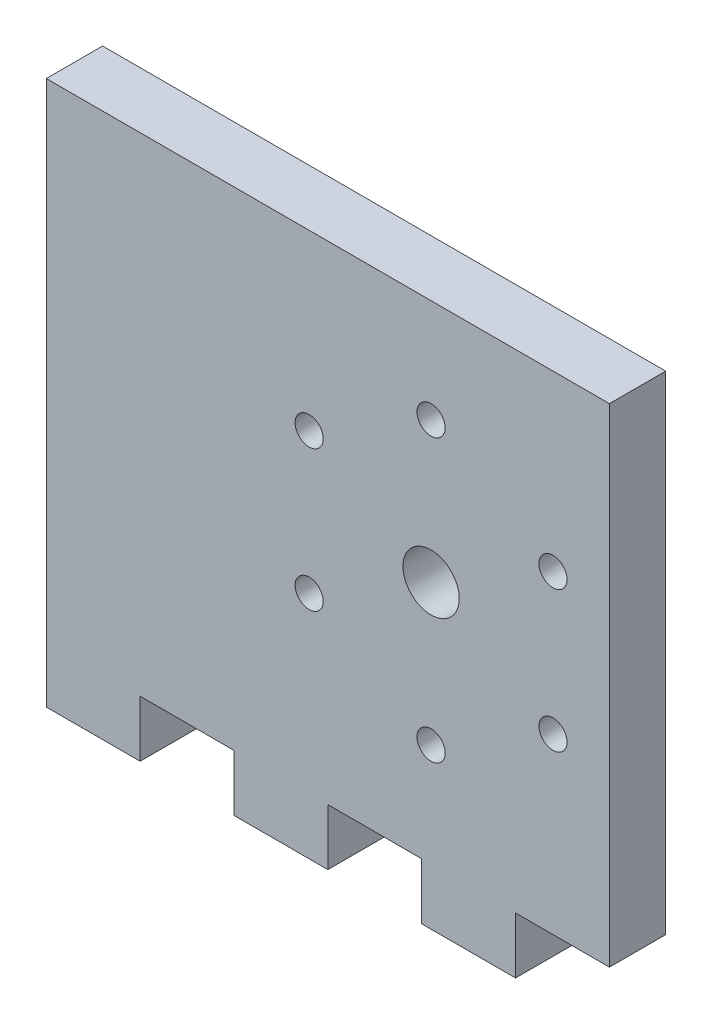
ISO-10303-21;
HEADER;
FILE_DESCRIPTION(('STEP AP214'),'2;1');
FILE_NAME('part.step','',(''),(''),'','','');
FILE_SCHEMA(('AUTOMOTIVE_DESIGN { 1 0 10303 214 1 1 1 1 }'));
ENDSEC;
DATA;
#1=APPLICATION_CONTEXT('core data for automotive mechanical design processes');
#2=APPLICATION_PROTOCOL_DEFINITION('international standard','automotive_design',2000,#1);
#3=PRODUCT_CONTEXT('',#1,'mechanical');
#4=PRODUCT('Part','Part','',(#3));
#5=PRODUCT_RELATED_PRODUCT_CATEGORY('part','',(#4));
#6=PRODUCT_DEFINITION_FORMATION('','',#4);
#7=PRODUCT_DEFINITION_CONTEXT('part definition',#1,'design');
#8=PRODUCT_DEFINITION('design','',#6,#7);
#9=PRODUCT_DEFINITION_SHAPE('','',#8);
#10=(LENGTH_UNIT() NAMED_UNIT(*) SI_UNIT(.MILLI.,.METRE.));
#11=(NAMED_UNIT(*) PLANE_ANGLE_UNIT() SI_UNIT($,.RADIAN.));
#12=(NAMED_UNIT(*) SI_UNIT($,.STERADIAN.) SOLID_ANGLE_UNIT());
#13=UNCERTAINTY_MEASURE_WITH_UNIT(LENGTH_MEASURE(1.E-05),#10,'distance_accuracy_value','');
#14=(GEOMETRIC_REPRESENTATION_CONTEXT(3) GLOBAL_UNCERTAINTY_ASSIGNED_CONTEXT((#13)) GLOBAL_UNIT_ASSIGNED_CONTEXT((#10,
#11,#12)) REPRESENTATION_CONTEXT('',''));
#15=CARTESIAN_POINT('',(0.,0.,0.));
#16=DIRECTION('',(0.,0.,1.));
#17=DIRECTION('',(1.,0.,0.));
#18=AXIS2_PLACEMENT_3D('',#15,#16,#17);
#19=CARTESIAN_POINT('',(0.,0.,3.));
#20=DIRECTION('',(0.,0.,-1.));
#21=DIRECTION('',(-1.,0.,0.));
#22=AXIS2_PLACEMENT_3D('',#19,#20,#21);
#23=PLANE('',#22);
#24=DIRECTION('',(-1.,0.,0.));
#25=VECTOR('',#24,1.);
#26=CARTESIAN_POINT('',(25.,0.,3.));
#27=LINE('',#26,#25);
#28=CARTESIAN_POINT('',(30.,0.,3.));
#29=VERTEX_POINT('',#28);
#30=CARTESIAN_POINT('',(0.,0.,3.));
#31=VERTEX_POINT('',#30);
#32=EDGE_CURVE('E226',#29,#31,#27,.T.);
#33=ORIENTED_EDGE('',*,*,#32,.T.);
#34=DIRECTION('',(0.,-1.,0.));
#35=VECTOR('',#34,1.);
#36=CARTESIAN_POINT('',(0.,0.,3.));
#37=LINE('',#36,#35);
#38=CARTESIAN_POINT('',(0.,-29.,3.));
#39=VERTEX_POINT('',#38);
#40=EDGE_CURVE('E247',#31,#39,#37,.T.);
#41=ORIENTED_EDGE('',*,*,#40,.T.);
#42=DIRECTION('',(1.,0.,0.));
#43=VECTOR('',#42,1.);
#44=CARTESIAN_POINT('',(0.,-29.,3.));
#45=LINE('',#44,#43);
#46=CARTESIAN_POINT('',(4.99999999999994,-29.,3.));
#47=VERTEX_POINT('',#46);
#48=EDGE_CURVE('E244',#39,#47,#45,.T.);
#49=ORIENTED_EDGE('',*,*,#48,.T.);
#50=DIRECTION('',(0.,1.,0.));
#51=VECTOR('',#50,1.);
#52=CARTESIAN_POINT('',(4.99999999999994,-29.,3.));
#53=LINE('',#52,#51);
#54=CARTESIAN_POINT('',(4.99999999999994,-26.,3.));
#55=VERTEX_POINT('',#54);
#56=EDGE_CURVE('E246',#47,#55,#53,.T.);
#57=ORIENTED_EDGE('',*,*,#56,.T.);
#58=DIRECTION('',(1.,0.,0.));
#59=VECTOR('',#58,1.);
#60=CARTESIAN_POINT('',(4.99999999999994,-26.,3.));
#61=LINE('',#60,#59);
#62=CARTESIAN_POINT('',(9.99999999999994,-26.,3.));
#63=VERTEX_POINT('',#62);
#64=EDGE_CURVE('E249',#55,#63,#61,.T.);
#65=ORIENTED_EDGE('',*,*,#64,.T.);
#66=DIRECTION('',(0.,-1.,0.));
#67=VECTOR('',#66,1.);
#68=CARTESIAN_POINT('',(9.99999999999994,-26.,3.));
#69=LINE('',#68,#67);
#70=CARTESIAN_POINT('',(9.99999999999995,-29.,3.));
#71=VERTEX_POINT('',#70);
#72=EDGE_CURVE('E255',#63,#71,#69,.T.);
#73=ORIENTED_EDGE('',*,*,#72,.T.);
#74=DIRECTION('',(1.,0.,0.));
#75=VECTOR('',#74,1.);
#76=CARTESIAN_POINT('',(9.99999999999995,-29.,3.));
#77=LINE('',#76,#75);
#78=CARTESIAN_POINT('',(14.9999999999999,-29.,3.));
#79=VERTEX_POINT('',#78);
#80=EDGE_CURVE('E257',#71,#79,#77,.T.);
#81=ORIENTED_EDGE('',*,*,#80,.T.);
#82=DIRECTION('',(0.,1.,0.));
#83=VECTOR('',#82,1.);
#84=CARTESIAN_POINT('',(14.9999999999999,-29.,3.));
#85=LINE('',#84,#83);
#86=CARTESIAN_POINT('',(15.,-26.,3.));
#87=VERTEX_POINT('',#86);
#88=EDGE_CURVE('E259',#79,#87,#85,.T.);
#89=ORIENTED_EDGE('',*,*,#88,.T.);
#90=DIRECTION('',(1.,0.,0.));
#91=VECTOR('',#90,1.);
#92=CARTESIAN_POINT('',(15.,-26.,3.));
#93=LINE('',#92,#91);
#94=CARTESIAN_POINT('',(20.,-26.,3.));
#95=VERTEX_POINT('',#94);
#96=EDGE_CURVE('E148',#87,#95,#93,.T.);
#97=ORIENTED_EDGE('',*,*,#96,.T.);
#98=DIRECTION('',(0.,-1.,0.));
#99=VECTOR('',#98,1.);
#100=CARTESIAN_POINT('',(20.,-29.,3.));
#101=LINE('',#100,#99);
#102=CARTESIAN_POINT('',(20.,-29.,3.));
#103=VERTEX_POINT('',#102);
#104=EDGE_CURVE('E142',#95,#103,#101,.T.);
#105=ORIENTED_EDGE('',*,*,#104,.T.);
#106=DIRECTION('',(1.,0.,0.));
#107=VECTOR('',#106,1.);
#108=CARTESIAN_POINT('',(20.,-29.,3.));
#109=LINE('',#108,#107);
#110=CARTESIAN_POINT('',(25.,-29.,3.));
#111=VERTEX_POINT('',#110);
#112=EDGE_CURVE('E146',#103,#111,#109,.T.);
#113=ORIENTED_EDGE('',*,*,#112,.T.);
#114=DIRECTION('',(0.,1.,0.));
#115=VECTOR('',#114,1.);
#116=CARTESIAN_POINT('',(25.,-29.,3.));
#117=LINE('',#116,#115);
#118=CARTESIAN_POINT('',(25.,-26.,3.));
#119=VERTEX_POINT('',#118);
#120=EDGE_CURVE('E50',#111,#119,#117,.T.);
#121=ORIENTED_EDGE('',*,*,#120,.T.);
#122=DIRECTION('',(1.,0.,0.));
#123=VECTOR('',#122,1.);
#124=CARTESIAN_POINT('',(25.,-26.,3.));
#125=LINE('',#124,#123);
#126=CARTESIAN_POINT('',(30.,-26.,3.));
#127=VERTEX_POINT('',#126);
#128=EDGE_CURVE('E194',#119,#127,#125,.T.);
#129=ORIENTED_EDGE('',*,*,#128,.T.);
#130=DIRECTION('',(0.,1.,0.));
#131=VECTOR('',#130,1.);
#132=CARTESIAN_POINT('',(30.,0.,3.));
#133=LINE('',#132,#131);
#134=EDGE_CURVE('E111',#127,#29,#133,.T.);
#135=ORIENTED_EDGE('',*,*,#134,.T.);
#136=EDGE_LOOP('',(#33,#41,#49,#57,#65,#73,#81,#89,#97,#105,#113,#121,#129,#135));
#137=FACE_BOUND('',#136,.T.);
#138=CARTESIAN_POINT('',(20.5,-5.50000000000007,3.));
#139=DIRECTION('',(0.,0.,1.));
#140=DIRECTION('',(1.,0.,0.));
#141=AXIS2_PLACEMENT_3D('',#138,#139,#140);
#142=CIRCLE('',#141,0.750000000000002);
#143=CARTESIAN_POINT('',(21.25,-5.50000000000007,3.));
#144=VERTEX_POINT('',#143);
#145=EDGE_CURVE('E170',#144,#144,#142,.T.);
#146=ORIENTED_EDGE('',*,*,#145,.F.);
#147=EDGE_LOOP('',(#146));
#148=FACE_BOUND('',#147,.T.);
#149=CARTESIAN_POINT('',(20.5,-13.0000000000001,3.));
#150=DIRECTION('',(0.,0.,1.));
#151=DIRECTION('',(1.,0.,0.));
#152=AXIS2_PLACEMENT_3D('',#149,#150,#151);
#153=CIRCLE('',#152,1.5);
#154=CARTESIAN_POINT('',(22.,-13.0000000000001,3.));
#155=VERTEX_POINT('',#154);
#156=EDGE_CURVE('E501',#155,#155,#153,.T.);
#157=ORIENTED_EDGE('',*,*,#156,.F.);
#158=EDGE_LOOP('',(#157));
#159=FACE_BOUND('',#158,.T.);
#160=CARTESIAN_POINT('',(26.9951905283833,-9.25000000000007,3.));
#161=DIRECTION('',(0.,0.,1.));
#162=DIRECTION('',(1.,0.,0.));
#163=AXIS2_PLACEMENT_3D('',#160,#161,#162);
#164=CIRCLE('',#163,0.750000000000002);
#165=CARTESIAN_POINT('',(27.7451905283833,-9.25000000000007,3.));
#166=VERTEX_POINT('',#165);
#167=EDGE_CURVE('E507',#166,#166,#164,.T.);
#168=ORIENTED_EDGE('',*,*,#167,.F.);
#169=EDGE_LOOP('',(#168));
#170=FACE_BOUND('',#169,.T.);
#171=CARTESIAN_POINT('',(26.9951905283833,-16.7500000000001,3.));
#172=DIRECTION('',(0.,0.,1.));
#173=DIRECTION('',(1.,0.,0.));
#174=AXIS2_PLACEMENT_3D('',#171,#172,#173);
#175=CIRCLE('',#174,0.750000000000005);
#176=CARTESIAN_POINT('',(27.7451905283833,-16.7500000000001,3.));
#177=VERTEX_POINT('',#176);
#178=EDGE_CURVE('E513',#177,#177,#175,.T.);
#179=ORIENTED_EDGE('',*,*,#178,.F.);
#180=EDGE_LOOP('',(#179));
#181=FACE_BOUND('',#180,.T.);
#182=CARTESIAN_POINT('',(20.5,-20.5000000000001,3.));
#183=DIRECTION('',(0.,0.,1.));
#184=DIRECTION('',(1.,0.,0.));
#185=AXIS2_PLACEMENT_3D('',#182,#183,#184);
#186=CIRCLE('',#185,0.750000000000002);
#187=CARTESIAN_POINT('',(21.25,-20.5000000000001,3.));
#188=VERTEX_POINT('',#187);
#189=EDGE_CURVE('E519',#188,#188,#186,.T.);
#190=ORIENTED_EDGE('',*,*,#189,.F.);
#191=EDGE_LOOP('',(#190));
#192=FACE_BOUND('',#191,.T.);
#193=CARTESIAN_POINT('',(14.0048094716167,-16.7500000000001,3.));
#194=DIRECTION('',(0.,0.,1.));
#195=DIRECTION('',(1.,0.,0.));
#196=AXIS2_PLACEMENT_3D('',#193,#194,#195);
#197=CIRCLE('',#196,0.750000000000002);
#198=CARTESIAN_POINT('',(14.7548094716167,-16.7500000000001,3.));
#199=VERTEX_POINT('',#198);
#200=EDGE_CURVE('E525',#199,#199,#197,.T.);
#201=ORIENTED_EDGE('',*,*,#200,.F.);
#202=EDGE_LOOP('',(#201));
#203=FACE_BOUND('',#202,.T.);
#204=CARTESIAN_POINT('',(14.0048094716167,-9.25000000000008,3.));
#205=DIRECTION('',(0.,0.,1.));
#206=DIRECTION('',(1.,0.,0.));
#207=AXIS2_PLACEMENT_3D('',#204,#205,#206);
#208=CIRCLE('',#207,0.750000000000002);
#209=CARTESIAN_POINT('',(14.7548094716167,-9.25000000000008,3.));
#210=VERTEX_POINT('',#209);
#211=EDGE_CURVE('E531',#210,#210,#208,.T.);
#212=ORIENTED_EDGE('',*,*,#211,.F.);
#213=EDGE_LOOP('',(#212));
#214=FACE_BOUND('',#213,.T.);
#215=ADVANCED_FACE('F33',(#137,#148,#159,#170,#181,#192,#203,#214),#23,.F.);
#216=CARTESIAN_POINT('',(0.,0.,0.));
#217=DIRECTION('',(0.,0.,-1.));
#218=DIRECTION('',(-1.,0.,0.));
#219=AXIS2_PLACEMENT_3D('',#216,#217,#218);
#220=PLANE('',#219);
#221=DIRECTION('',(-1.,0.,0.));
#222=VECTOR('',#221,1.);
#223=CARTESIAN_POINT('',(0.,0.,0.));
#224=LINE('',#223,#222);
#225=CARTESIAN_POINT('',(30.,0.,0.));
#226=VERTEX_POINT('',#225);
#227=CARTESIAN_POINT('',(0.,0.,0.));
#228=VERTEX_POINT('',#227);
#229=EDGE_CURVE('E173',#226,#228,#224,.T.);
#230=ORIENTED_EDGE('',*,*,#229,.F.);
#231=DIRECTION('',(0.,1.,0.));
#232=VECTOR('',#231,1.);
#233=CARTESIAN_POINT('',(30.,0.,0.));
#234=LINE('',#233,#232);
#235=CARTESIAN_POINT('',(30.,-26.,0.));
#236=VERTEX_POINT('',#235);
#237=EDGE_CURVE('E169',#236,#226,#234,.T.);
#238=ORIENTED_EDGE('',*,*,#237,.F.);
#239=DIRECTION('',(1.,0.,0.));
#240=VECTOR('',#239,1.);
#241=CARTESIAN_POINT('',(25.,-26.,0.));
#242=LINE('',#241,#240);
#243=CARTESIAN_POINT('',(25.,-26.,0.));
#244=VERTEX_POINT('',#243);
#245=EDGE_CURVE('E166',#244,#236,#242,.T.);
#246=ORIENTED_EDGE('',*,*,#245,.F.);
#247=DIRECTION('',(0.,1.,0.));
#248=VECTOR('',#247,1.);
#249=CARTESIAN_POINT('',(25.,-29.,0.));
#250=LINE('',#249,#248);
#251=CARTESIAN_POINT('',(25.,-29.,0.));
#252=VERTEX_POINT('',#251);
#253=EDGE_CURVE('E103',#252,#244,#250,.T.);
#254=ORIENTED_EDGE('',*,*,#253,.F.);
#255=DIRECTION('',(1.,0.,0.));
#256=VECTOR('',#255,1.);
#257=CARTESIAN_POINT('',(20.,-29.,0.));
#258=LINE('',#257,#256);
#259=CARTESIAN_POINT('',(20.,-29.,0.));
#260=VERTEX_POINT('',#259);
#261=EDGE_CURVE('E97',#260,#252,#258,.T.);
#262=ORIENTED_EDGE('',*,*,#261,.F.);
#263=DIRECTION('',(0.,-1.,0.));
#264=VECTOR('',#263,1.);
#265=CARTESIAN_POINT('',(20.,-29.,0.));
#266=LINE('',#265,#264);
#267=CARTESIAN_POINT('',(20.,-26.,0.));
#268=VERTEX_POINT('',#267);
#269=EDGE_CURVE('E156',#268,#260,#266,.T.);
#270=ORIENTED_EDGE('',*,*,#269,.F.);
#271=DIRECTION('',(1.,0.,0.));
#272=VECTOR('',#271,1.);
#273=CARTESIAN_POINT('',(15.,-26.,0.));
#274=LINE('',#273,#272);
#275=CARTESIAN_POINT('',(15.,-26.,0.));
#276=VERTEX_POINT('',#275);
#277=EDGE_CURVE('E189',#276,#268,#274,.T.);
#278=ORIENTED_EDGE('',*,*,#277,.F.);
#279=DIRECTION('',(0.,1.,0.));
#280=VECTOR('',#279,1.);
#281=CARTESIAN_POINT('',(14.9999999999999,-29.,0.));
#282=LINE('',#281,#280);
#283=CARTESIAN_POINT('',(14.9999999999999,-29.,0.));
#284=VERTEX_POINT('',#283);
#285=EDGE_CURVE('E187',#284,#276,#282,.T.);
#286=ORIENTED_EDGE('',*,*,#285,.F.);
#287=DIRECTION('',(1.,0.,0.));
#288=VECTOR('',#287,1.);
#289=CARTESIAN_POINT('',(9.99999999999995,-29.,0.));
#290=LINE('',#289,#288);
#291=CARTESIAN_POINT('',(9.99999999999995,-29.,0.));
#292=VERTEX_POINT('',#291);
#293=EDGE_CURVE('E185',#292,#284,#290,.T.);
#294=ORIENTED_EDGE('',*,*,#293,.F.);
#295=DIRECTION('',(0.,-1.,0.));
#296=VECTOR('',#295,1.);
#297=CARTESIAN_POINT('',(9.99999999999994,-26.,0.));
#298=LINE('',#297,#296);
#299=CARTESIAN_POINT('',(9.99999999999994,-26.,0.));
#300=VERTEX_POINT('',#299);
#301=EDGE_CURVE('E183',#300,#292,#298,.T.);
#302=ORIENTED_EDGE('',*,*,#301,.F.);
#303=DIRECTION('',(1.,0.,0.));
#304=VECTOR('',#303,1.);
#305=CARTESIAN_POINT('',(4.99999999999994,-26.,0.));
#306=LINE('',#305,#304);
#307=CARTESIAN_POINT('',(4.99999999999994,-26.,0.));
#308=VERTEX_POINT('',#307);
#309=EDGE_CURVE('E181',#308,#300,#306,.T.);
#310=ORIENTED_EDGE('',*,*,#309,.F.);
#311=DIRECTION('',(0.,1.,0.));
#312=VECTOR('',#311,1.);
#313=CARTESIAN_POINT('',(4.99999999999994,-29.,0.));
#314=LINE('',#313,#312);
#315=CARTESIAN_POINT('',(4.99999999999994,-29.,0.));
#316=VERTEX_POINT('',#315);
#317=EDGE_CURVE('E179',#316,#308,#314,.T.);
#318=ORIENTED_EDGE('',*,*,#317,.F.);
#319=DIRECTION('',(1.,0.,0.));
#320=VECTOR('',#319,1.);
#321=CARTESIAN_POINT('',(0.,-29.,0.));
#322=LINE('',#321,#320);
#323=CARTESIAN_POINT('',(0.,-29.,0.));
#324=VERTEX_POINT('',#323);
#325=EDGE_CURVE('E177',#324,#316,#322,.T.);
#326=ORIENTED_EDGE('',*,*,#325,.F.);
#327=DIRECTION('',(0.,-1.,0.));
#328=VECTOR('',#327,1.);
#329=CARTESIAN_POINT('',(0.,0.,0.));
#330=LINE('',#329,#328);
#331=EDGE_CURVE('E175',#228,#324,#330,.T.);
#332=ORIENTED_EDGE('',*,*,#331,.F.);
#333=EDGE_LOOP('',(#230,#238,#246,#254,#262,#270,#278,#286,#294,#302,#310,#318,#326,#332));
#334=FACE_BOUND('',#333,.T.);
#335=CARTESIAN_POINT('',(14.0048094716167,-16.7500000000001,0.));
#336=DIRECTION('',(0.,0.,1.));
#337=DIRECTION('',(1.,0.,0.));
#338=AXIS2_PLACEMENT_3D('',#335,#336,#337);
#339=CIRCLE('',#338,0.750000000000002);
#340=CARTESIAN_POINT('',(14.7548094716167,-16.7500000000001,0.));
#341=VERTEX_POINT('',#340);
#342=EDGE_CURVE('E528',#341,#341,#339,.T.);
#343=ORIENTED_EDGE('',*,*,#342,.T.);
#344=EDGE_LOOP('',(#343));
#345=FACE_BOUND('',#344,.T.);
#346=CARTESIAN_POINT('',(26.9951905283833,-16.7500000000001,0.));
#347=DIRECTION('',(0.,0.,1.));
#348=DIRECTION('',(1.,0.,0.));
#349=AXIS2_PLACEMENT_3D('',#346,#347,#348);
#350=CIRCLE('',#349,0.750000000000005);
#351=CARTESIAN_POINT('',(27.7451905283833,-16.7500000000001,0.));
#352=VERTEX_POINT('',#351);
#353=EDGE_CURVE('E516',#352,#352,#350,.T.);
#354=ORIENTED_EDGE('',*,*,#353,.T.);
#355=EDGE_LOOP('',(#354));
#356=FACE_BOUND('',#355,.T.);
#357=CARTESIAN_POINT('',(20.5,-13.0000000000001,0.));
#358=DIRECTION('',(0.,0.,1.));
#359=DIRECTION('',(1.,0.,0.));
#360=AXIS2_PLACEMENT_3D('',#357,#358,#359);
#361=CIRCLE('',#360,1.5);
#362=CARTESIAN_POINT('',(22.,-13.0000000000001,0.));
#363=VERTEX_POINT('',#362);
#364=EDGE_CURVE('E504',#363,#363,#361,.T.);
#365=ORIENTED_EDGE('',*,*,#364,.T.);
#366=EDGE_LOOP('',(#365));
#367=FACE_BOUND('',#366,.T.);
#368=CARTESIAN_POINT('',(20.5,-5.50000000000007,0.));
#369=DIRECTION('',(0.,0.,1.));
#370=DIRECTION('',(1.,0.,0.));
#371=AXIS2_PLACEMENT_3D('',#368,#369,#370);
#372=CIRCLE('',#371,0.750000000000002);
#373=CARTESIAN_POINT('',(21.25,-5.50000000000007,0.));
#374=VERTEX_POINT('',#373);
#375=EDGE_CURVE('E498',#374,#374,#372,.T.);
#376=ORIENTED_EDGE('',*,*,#375,.T.);
#377=EDGE_LOOP('',(#376));
#378=FACE_BOUND('',#377,.T.);
#379=CARTESIAN_POINT('',(26.9951905283833,-9.25000000000007,0.));
#380=DIRECTION('',(0.,0.,1.));
#381=DIRECTION('',(1.,0.,0.));
#382=AXIS2_PLACEMENT_3D('',#379,#380,#381);
#383=CIRCLE('',#382,0.750000000000002);
#384=CARTESIAN_POINT('',(27.7451905283833,-9.25000000000007,0.));
#385=VERTEX_POINT('',#384);
#386=EDGE_CURVE('E510',#385,#385,#383,.T.);
#387=ORIENTED_EDGE('',*,*,#386,.T.);
#388=EDGE_LOOP('',(#387));
#389=FACE_BOUND('',#388,.T.);
#390=CARTESIAN_POINT('',(20.5,-20.5000000000001,0.));
#391=DIRECTION('',(0.,0.,1.));
#392=DIRECTION('',(1.,0.,0.));
#393=AXIS2_PLACEMENT_3D('',#390,#391,#392);
#394=CIRCLE('',#393,0.750000000000002);
#395=CARTESIAN_POINT('',(21.25,-20.5000000000001,0.));
#396=VERTEX_POINT('',#395);
#397=EDGE_CURVE('E522',#396,#396,#394,.T.);
#398=ORIENTED_EDGE('',*,*,#397,.T.);
#399=EDGE_LOOP('',(#398));
#400=FACE_BOUND('',#399,.T.);
#401=CARTESIAN_POINT('',(14.0048094716167,-9.25000000000008,0.));
#402=DIRECTION('',(0.,0.,1.));
#403=DIRECTION('',(1.,0.,0.));
#404=AXIS2_PLACEMENT_3D('',#401,#402,#403);
#405=CIRCLE('',#404,0.750000000000002);
#406=CARTESIAN_POINT('',(14.7548094716167,-9.25000000000008,0.));
#407=VERTEX_POINT('',#406);
#408=EDGE_CURVE('E534',#407,#407,#405,.T.);
#409=ORIENTED_EDGE('',*,*,#408,.T.);
#410=EDGE_LOOP('',(#409));
#411=FACE_BOUND('',#410,.T.);
#412=ADVANCED_FACE('F231',(#334,#345,#356,#367,#378,#389,#400,#411),#220,.T.);
#413=CARTESIAN_POINT('',(25.,-26.,3.));
#414=DIRECTION('',(0.,1.,0.));
#415=DIRECTION('',(-1.,0.,0.));
#416=AXIS2_PLACEMENT_3D('',#413,#414,#415);
#417=PLANE('',#416);
#418=ORIENTED_EDGE('',*,*,#245,.T.);
#419=DIRECTION('',(0.,0.,-1.));
#420=VECTOR('',#419,1.);
#421=CARTESIAN_POINT('',(30.,-26.,3.));
#422=LINE('',#421,#420);
#423=EDGE_CURVE('E11',#127,#236,#422,.T.);
#424=ORIENTED_EDGE('',*,*,#423,.F.);
#425=ORIENTED_EDGE('',*,*,#128,.F.);
#426=DIRECTION('',(0.,0.,-1.));
#427=VECTOR('',#426,1.);
#428=CARTESIAN_POINT('',(25.,-26.,3.));
#429=LINE('',#428,#427);
#430=EDGE_CURVE('E162',#119,#244,#429,.T.);
#431=ORIENTED_EDGE('',*,*,#430,.T.);
#432=EDGE_LOOP('',(#418,#424,#425,#431));
#433=FACE_BOUND('',#432,.T.);
#434=ADVANCED_FACE('F35',(#433),#417,.F.);
#435=CARTESIAN_POINT('',(30.,0.,3.));
#436=DIRECTION('',(-1.,0.,0.));
#437=DIRECTION('',(0.,-1.,0.));
#438=AXIS2_PLACEMENT_3D('',#435,#436,#437);
#439=PLANE('',#438);
#440=ORIENTED_EDGE('',*,*,#237,.T.);
#441=DIRECTION('',(0.,0.,-1.));
#442=VECTOR('',#441,1.);
#443=CARTESIAN_POINT('',(30.,0.,3.));
#444=LINE('',#443,#442);
#445=EDGE_CURVE('E42',#29,#226,#444,.T.);
#446=ORIENTED_EDGE('',*,*,#445,.F.);
#447=ORIENTED_EDGE('',*,*,#134,.F.);
#448=ORIENTED_EDGE('',*,*,#423,.T.);
#449=EDGE_LOOP('',(#440,#446,#447,#448));
#450=FACE_BOUND('',#449,.T.);
#451=ADVANCED_FACE('F227',(#450),#439,.F.);
#452=CARTESIAN_POINT('',(0.,0.,3.));
#453=DIRECTION('',(0.,-1.,0.));
#454=DIRECTION('',(1.,0.,0.));
#455=AXIS2_PLACEMENT_3D('',#452,#453,#454);
#456=PLANE('',#455);
#457=ORIENTED_EDGE('',*,*,#229,.T.);
#458=DIRECTION('',(0.,0.,-1.));
#459=VECTOR('',#458,1.);
#460=CARTESIAN_POINT('',(0.,0.,3.));
#461=LINE('',#460,#459);
#462=EDGE_CURVE('E219',#31,#228,#461,.T.);
#463=ORIENTED_EDGE('',*,*,#462,.F.);
#464=ORIENTED_EDGE('',*,*,#32,.F.);
#465=ORIENTED_EDGE('',*,*,#445,.T.);
#466=EDGE_LOOP('',(#457,#463,#464,#465));
#467=FACE_BOUND('',#466,.T.);
#468=ADVANCED_FACE('F224',(#467),#456,.F.);
#469=CARTESIAN_POINT('',(0.,0.,3.));
#470=DIRECTION('',(1.,0.,0.));
#471=DIRECTION('',(0.,1.,0.));
#472=AXIS2_PLACEMENT_3D('',#469,#470,#471);
#473=PLANE('',#472);
#474=ORIENTED_EDGE('',*,*,#331,.T.);
#475=DIRECTION('',(0.,0.,-1.));
#476=VECTOR('',#475,1.);
#477=CARTESIAN_POINT('',(0.,-29.,3.));
#478=LINE('',#477,#476);
#479=EDGE_CURVE('E216',#39,#324,#478,.T.);
#480=ORIENTED_EDGE('',*,*,#479,.F.);
#481=ORIENTED_EDGE('',*,*,#40,.F.);
#482=ORIENTED_EDGE('',*,*,#462,.T.);
#483=EDGE_LOOP('',(#474,#480,#481,#482));
#484=FACE_BOUND('',#483,.T.);
#485=ADVANCED_FACE('F238',(#484),#473,.F.);
#486=CARTESIAN_POINT('',(0.,-29.,3.));
#487=DIRECTION('',(0.,1.,0.));
#488=DIRECTION('',(0.,0.,1.));
#489=AXIS2_PLACEMENT_3D('',#486,#487,#488);
#490=PLANE('',#489);
#491=ORIENTED_EDGE('',*,*,#325,.T.);
#492=DIRECTION('',(0.,0.,-1.));
#493=VECTOR('',#492,1.);
#494=CARTESIAN_POINT('',(4.99999999999994,-29.,3.));
#495=LINE('',#494,#493);
#496=EDGE_CURVE('E213',#47,#316,#495,.T.);
#497=ORIENTED_EDGE('',*,*,#496,.F.);
#498=ORIENTED_EDGE('',*,*,#48,.F.);
#499=ORIENTED_EDGE('',*,*,#479,.T.);
#500=EDGE_LOOP('',(#491,#497,#498,#499));
#501=FACE_BOUND('',#500,.T.);
#502=ADVANCED_FACE('F242',(#501),#490,.F.);
#503=CARTESIAN_POINT('',(4.99999999999994,-29.,3.));
#504=DIRECTION('',(-1.,0.,0.));
#505=DIRECTION('',(0.,0.,1.));
#506=AXIS2_PLACEMENT_3D('',#503,#504,#505);
#507=PLANE('',#506);
#508=ORIENTED_EDGE('',*,*,#317,.T.);
#509=DIRECTION('',(0.,0.,-1.));
#510=VECTOR('',#509,1.);
#511=CARTESIAN_POINT('',(4.99999999999994,-26.,3.));
#512=LINE('',#511,#510);
#513=EDGE_CURVE('E210',#55,#308,#512,.T.);
#514=ORIENTED_EDGE('',*,*,#513,.F.);
#515=ORIENTED_EDGE('',*,*,#56,.F.);
#516=ORIENTED_EDGE('',*,*,#496,.T.);
#517=EDGE_LOOP('',(#508,#514,#515,#516));
#518=FACE_BOUND('',#517,.T.);
#519=ADVANCED_FACE('F285',(#518),#507,.F.);
#520=CARTESIAN_POINT('',(4.99999999999994,-26.,3.));
#521=DIRECTION('',(0.,1.,0.));
#522=DIRECTION('',(-1.,0.,0.));
#523=AXIS2_PLACEMENT_3D('',#520,#521,#522);
#524=PLANE('',#523);
#525=ORIENTED_EDGE('',*,*,#309,.T.);
#526=DIRECTION('',(0.,0.,-1.));
#527=VECTOR('',#526,1.);
#528=CARTESIAN_POINT('',(9.99999999999994,-26.,3.));
#529=LINE('',#528,#527);
#530=EDGE_CURVE('E207',#63,#300,#529,.T.);
#531=ORIENTED_EDGE('',*,*,#530,.F.);
#532=ORIENTED_EDGE('',*,*,#64,.F.);
#533=ORIENTED_EDGE('',*,*,#513,.T.);
#534=EDGE_LOOP('',(#525,#531,#532,#533));
#535=FACE_BOUND('',#534,.T.);
#536=ADVANCED_FACE('F282',(#535),#524,.F.);
#537=CARTESIAN_POINT('',(9.99999999999994,-26.,3.));
#538=DIRECTION('',(1.,0.,0.));
#539=DIRECTION('',(0.,1.,0.));
#540=AXIS2_PLACEMENT_3D('',#537,#538,#539);
#541=PLANE('',#540);
#542=ORIENTED_EDGE('',*,*,#301,.T.);
#543=DIRECTION('',(0.,0.,-1.));
#544=VECTOR('',#543,1.);
#545=CARTESIAN_POINT('',(9.99999999999995,-29.,3.));
#546=LINE('',#545,#544);
#547=EDGE_CURVE('E204',#71,#292,#546,.T.);
#548=ORIENTED_EDGE('',*,*,#547,.F.);
#549=ORIENTED_EDGE('',*,*,#72,.F.);
#550=ORIENTED_EDGE('',*,*,#530,.T.);
#551=EDGE_LOOP('',(#542,#548,#549,#550));
#552=FACE_BOUND('',#551,.T.);
#553=ADVANCED_FACE('F278',(#552),#541,.F.);
#554=CARTESIAN_POINT('',(9.99999999999995,-29.,3.));
#555=DIRECTION('',(0.,1.,0.));
#556=DIRECTION('',(0.,0.,1.));
#557=AXIS2_PLACEMENT_3D('',#554,#555,#556);
#558=PLANE('',#557);
#559=ORIENTED_EDGE('',*,*,#293,.T.);
#560=DIRECTION('',(0.,0.,-1.));
#561=VECTOR('',#560,1.);
#562=CARTESIAN_POINT('',(14.9999999999999,-29.,3.));
#563=LINE('',#562,#561);
#564=EDGE_CURVE('E201',#79,#284,#563,.T.);
#565=ORIENTED_EDGE('',*,*,#564,.F.);
#566=ORIENTED_EDGE('',*,*,#80,.F.);
#567=ORIENTED_EDGE('',*,*,#547,.T.);
#568=EDGE_LOOP('',(#559,#565,#566,#567));
#569=FACE_BOUND('',#568,.T.);
#570=ADVANCED_FACE('F274',(#569),#558,.F.);
#571=CARTESIAN_POINT('',(14.9999999999999,-29.,3.));
#572=DIRECTION('',(-1.,0.,0.));
#573=DIRECTION('',(0.,-1.,0.));
#574=AXIS2_PLACEMENT_3D('',#571,#572,#573);
#575=PLANE('',#574);
#576=ORIENTED_EDGE('',*,*,#285,.T.);
#577=DIRECTION('',(0.,0.,-1.));
#578=VECTOR('',#577,1.);
#579=CARTESIAN_POINT('',(15.,-26.,3.));
#580=LINE('',#579,#578);
#581=EDGE_CURVE('E198',#87,#276,#580,.T.);
#582=ORIENTED_EDGE('',*,*,#581,.F.);
#583=ORIENTED_EDGE('',*,*,#88,.F.);
#584=ORIENTED_EDGE('',*,*,#564,.T.);
#585=EDGE_LOOP('',(#576,#582,#583,#584));
#586=FACE_BOUND('',#585,.T.);
#587=ADVANCED_FACE('F265',(#586),#575,.F.);
#588=CARTESIAN_POINT('',(15.,-26.,3.));
#589=DIRECTION('',(0.,1.,0.));
#590=DIRECTION('',(-1.,0.,0.));
#591=AXIS2_PLACEMENT_3D('',#588,#589,#590);
#592=PLANE('',#591);
#593=ORIENTED_EDGE('',*,*,#277,.T.);
#594=DIRECTION('',(0.,0.,-1.));
#595=VECTOR('',#594,1.);
#596=CARTESIAN_POINT('',(20.,-26.,3.));
#597=LINE('',#596,#595);
#598=EDGE_CURVE('E157',#95,#268,#597,.T.);
#599=ORIENTED_EDGE('',*,*,#598,.F.);
#600=ORIENTED_EDGE('',*,*,#96,.F.);
#601=ORIENTED_EDGE('',*,*,#581,.T.);
#602=EDGE_LOOP('',(#593,#599,#600,#601));
#603=FACE_BOUND('',#602,.T.);
#604=ADVANCED_FACE('F269',(#603),#592,.F.);
#605=CARTESIAN_POINT('',(20.,-29.,3.));
#606=DIRECTION('',(1.,0.,0.));
#607=DIRECTION('',(0.,1.,0.));
#608=AXIS2_PLACEMENT_3D('',#605,#606,#607);
#609=PLANE('',#608);
#610=ORIENTED_EDGE('',*,*,#269,.T.);
#611=DIRECTION('',(0.,0.,-1.));
#612=VECTOR('',#611,1.);
#613=CARTESIAN_POINT('',(20.,-29.,3.));
#614=LINE('',#613,#612);
#615=EDGE_CURVE('E153',#103,#260,#614,.T.);
#616=ORIENTED_EDGE('',*,*,#615,.F.);
#617=ORIENTED_EDGE('',*,*,#104,.F.);
#618=ORIENTED_EDGE('',*,*,#598,.T.);
#619=EDGE_LOOP('',(#610,#616,#617,#618));
#620=FACE_BOUND('',#619,.T.);
#621=ADVANCED_FACE('F154',(#620),#609,.F.);
#622=CARTESIAN_POINT('',(20.,-29.,3.));
#623=DIRECTION('',(0.,1.,0.));
#624=DIRECTION('',(-1.,0.,0.));
#625=AXIS2_PLACEMENT_3D('',#622,#623,#624);
#626=PLANE('',#625);
#627=ORIENTED_EDGE('',*,*,#261,.T.);
#628=DIRECTION('',(0.,0.,-1.));
#629=VECTOR('',#628,1.);
#630=CARTESIAN_POINT('',(25.,-29.,3.));
#631=LINE('',#630,#629);
#632=EDGE_CURVE('E158',#111,#252,#631,.T.);
#633=ORIENTED_EDGE('',*,*,#632,.F.);
#634=ORIENTED_EDGE('',*,*,#112,.F.);
#635=ORIENTED_EDGE('',*,*,#615,.T.);
#636=EDGE_LOOP('',(#627,#633,#634,#635));
#637=FACE_BOUND('',#636,.T.);
#638=ADVANCED_FACE('F160',(#637),#626,.F.);
#639=CARTESIAN_POINT('',(25.,-29.,3.));
#640=DIRECTION('',(-1.,0.,0.));
#641=DIRECTION('',(0.,-1.,0.));
#642=AXIS2_PLACEMENT_3D('',#639,#640,#641);
#643=PLANE('',#642);
#644=ORIENTED_EDGE('',*,*,#253,.T.);
#645=ORIENTED_EDGE('',*,*,#430,.F.);
#646=ORIENTED_EDGE('',*,*,#120,.F.);
#647=ORIENTED_EDGE('',*,*,#632,.T.);
#648=EDGE_LOOP('',(#644,#645,#646,#647));
#649=FACE_BOUND('',#648,.T.);
#650=ADVANCED_FACE('F305',(#649),#643,.F.);
#651=CARTESIAN_POINT('',(20.5,-5.50000000000007,3.));
#652=DIRECTION('',(0.,0.,-1.));
#653=DIRECTION('',(-1.,0.,0.));
#654=AXIS2_PLACEMENT_3D('',#651,#652,#653);
#655=CYLINDRICAL_SURFACE('',#654,0.750000000000002);
#656=ORIENTED_EDGE('',*,*,#145,.T.);
#657=EDGE_LOOP('',(#656));
#658=FACE_BOUND('',#657,.T.);
#659=ORIENTED_EDGE('',*,*,#375,.F.);
#660=EDGE_LOOP('',(#659));
#661=FACE_BOUND('',#660,.T.);
#662=ADVANCED_FACE('F302',(#658,#661),#655,.F.);
#663=CARTESIAN_POINT('',(20.5,-13.0000000000001,3.));
#664=DIRECTION('',(0.,0.,-1.));
#665=DIRECTION('',(-1.,0.,0.));
#666=AXIS2_PLACEMENT_3D('',#663,#664,#665);
#667=CYLINDRICAL_SURFACE('',#666,1.5);
#668=ORIENTED_EDGE('',*,*,#156,.T.);
#669=EDGE_LOOP('',(#668));
#670=FACE_BOUND('',#669,.T.);
#671=ORIENTED_EDGE('',*,*,#364,.F.);
#672=EDGE_LOOP('',(#671));
#673=FACE_BOUND('',#672,.T.);
#674=ADVANCED_FACE('F353',(#670,#673),#667,.F.);
#675=CARTESIAN_POINT('',(26.9951905283833,-9.25000000000007,3.));
#676=DIRECTION('',(0.,0.,-1.));
#677=DIRECTION('',(-1.,0.,0.));
#678=AXIS2_PLACEMENT_3D('',#675,#676,#677);
#679=CYLINDRICAL_SURFACE('',#678,0.750000000000002);
#680=ORIENTED_EDGE('',*,*,#167,.T.);
#681=EDGE_LOOP('',(#680));
#682=FACE_BOUND('',#681,.T.);
#683=ORIENTED_EDGE('',*,*,#386,.F.);
#684=EDGE_LOOP('',(#683));
#685=FACE_BOUND('',#684,.T.);
#686=ADVANCED_FACE('F360',(#682,#685),#679,.F.);
#687=CARTESIAN_POINT('',(26.9951905283833,-16.7500000000001,3.));
#688=DIRECTION('',(0.,0.,-1.));
#689=DIRECTION('',(-1.,0.,0.));
#690=AXIS2_PLACEMENT_3D('',#687,#688,#689);
#691=CYLINDRICAL_SURFACE('',#690,0.750000000000005);
#692=ORIENTED_EDGE('',*,*,#178,.T.);
#693=EDGE_LOOP('',(#692));
#694=FACE_BOUND('',#693,.T.);
#695=ORIENTED_EDGE('',*,*,#353,.F.);
#696=EDGE_LOOP('',(#695));
#697=FACE_BOUND('',#696,.T.);
#698=ADVANCED_FACE('F367',(#694,#697),#691,.F.);
#699=CARTESIAN_POINT('',(20.5,-20.5000000000001,3.));
#700=DIRECTION('',(0.,0.,-1.));
#701=DIRECTION('',(-1.,0.,0.));
#702=AXIS2_PLACEMENT_3D('',#699,#700,#701);
#703=CYLINDRICAL_SURFACE('',#702,0.750000000000002);
#704=ORIENTED_EDGE('',*,*,#189,.T.);
#705=EDGE_LOOP('',(#704));
#706=FACE_BOUND('',#705,.T.);
#707=ORIENTED_EDGE('',*,*,#397,.F.);
#708=EDGE_LOOP('',(#707));
#709=FACE_BOUND('',#708,.T.);
#710=ADVANCED_FACE('F375',(#706,#709),#703,.F.);
#711=CARTESIAN_POINT('',(14.0048094716167,-16.7500000000001,3.));
#712=DIRECTION('',(0.,0.,-1.));
#713=DIRECTION('',(-1.,0.,0.));
#714=AXIS2_PLACEMENT_3D('',#711,#712,#713);
#715=CYLINDRICAL_SURFACE('',#714,0.750000000000002);
#716=ORIENTED_EDGE('',*,*,#200,.T.);
#717=EDGE_LOOP('',(#716));
#718=FACE_BOUND('',#717,.T.);
#719=ORIENTED_EDGE('',*,*,#342,.F.);
#720=EDGE_LOOP('',(#719));
#721=FACE_BOUND('',#720,.T.);
#722=ADVANCED_FACE('F383',(#718,#721),#715,.F.);
#723=CARTESIAN_POINT('',(14.0048094716167,-9.25000000000008,3.));
#724=DIRECTION('',(0.,0.,-1.));
#725=DIRECTION('',(-1.,0.,0.));
#726=AXIS2_PLACEMENT_3D('',#723,#724,#725);
#727=CYLINDRICAL_SURFACE('',#726,0.750000000000002);
#728=ORIENTED_EDGE('',*,*,#211,.T.);
#729=EDGE_LOOP('',(#728));
#730=FACE_BOUND('',#729,.T.);
#731=ORIENTED_EDGE('',*,*,#408,.F.);
#732=EDGE_LOOP('',(#731));
#733=FACE_BOUND('',#732,.T.);
#734=ADVANCED_FACE('F391',(#730,#733),#727,.F.);
#735=CLOSED_SHELL('',(#215,#412,#434,#451,#468,#485,#502,#519,#536,#553,#570,#587,#604,#621,
#638,#650,#662,#674,#686,#698,#710,#722,#734));
#736=MANIFOLD_SOLID_BREP('B2',#735);
#737=ADVANCED_BREP_SHAPE_REPRESENTATION('',(#18,#736),#14);
#738=SHAPE_DEFINITION_REPRESENTATION(#9,#737);
ENDSEC;
END-ISO-10303-21;
